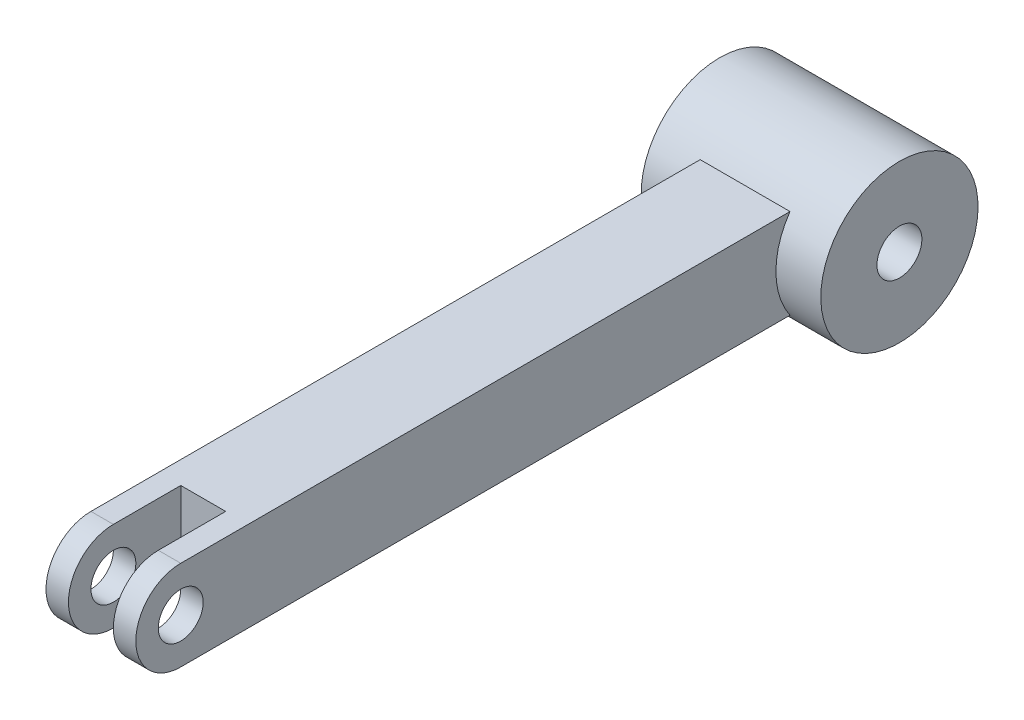
ISO-10303-21;
HEADER;
FILE_DESCRIPTION(('STEP AP214'),'2;1');
FILE_NAME('part.step','',(''),(''),'','','');
FILE_SCHEMA(('AUTOMOTIVE_DESIGN { 1 0 10303 214 1 1 1 1 }'));
ENDSEC;
DATA;
#1=APPLICATION_CONTEXT('core data for automotive mechanical design processes');
#2=APPLICATION_PROTOCOL_DEFINITION('international standard','automotive_design',2000,#1);
#3=PRODUCT_CONTEXT('',#1,'mechanical');
#4=PRODUCT('Part','Part','',(#3));
#5=PRODUCT_RELATED_PRODUCT_CATEGORY('part','',(#4));
#6=PRODUCT_DEFINITION_FORMATION('','',#4);
#7=PRODUCT_DEFINITION_CONTEXT('part definition',#1,'design');
#8=PRODUCT_DEFINITION('design','',#6,#7);
#9=PRODUCT_DEFINITION_SHAPE('','',#8);
#10=(LENGTH_UNIT() NAMED_UNIT(*) SI_UNIT(.MILLI.,.METRE.));
#11=(NAMED_UNIT(*) PLANE_ANGLE_UNIT() SI_UNIT($,.RADIAN.));
#12=(NAMED_UNIT(*) SI_UNIT($,.STERADIAN.) SOLID_ANGLE_UNIT());
#13=UNCERTAINTY_MEASURE_WITH_UNIT(LENGTH_MEASURE(1.E-05),#10,'distance_accuracy_value','');
#14=(GEOMETRIC_REPRESENTATION_CONTEXT(3) GLOBAL_UNCERTAINTY_ASSIGNED_CONTEXT((#13)) GLOBAL_UNIT_ASSIGNED_CONTEXT((#10,
#11,#12)) REPRESENTATION_CONTEXT('',''));
#15=CARTESIAN_POINT('',(0.,0.,0.));
#16=DIRECTION('',(0.,0.,1.));
#17=DIRECTION('',(1.,0.,0.));
#18=AXIS2_PLACEMENT_3D('',#15,#16,#17);
#19=CARTESIAN_POINT('',(-2.,0.,30.));
#20=DIRECTION('',(1.,0.,0.));
#21=DIRECTION('',(0.,1.,0.));
#22=AXIS2_PLACEMENT_3D('',#19,#20,#21);
#23=CYLINDRICAL_SURFACE('',#22,2.);
#24=CARTESIAN_POINT('',(1.,0.,30.));
#25=DIRECTION('',(1.,0.,0.));
#26=DIRECTION('',(0.,1.,0.));
#27=AXIS2_PLACEMENT_3D('',#24,#25,#26);
#28=CIRCLE('',#27,2.);
#29=CARTESIAN_POINT('',(1.,-2.,30.));
#30=VERTEX_POINT('',#29);
#31=CARTESIAN_POINT('',(1.,2.00000000000001,30.));
#32=VERTEX_POINT('',#31);
#33=EDGE_CURVE('E122',#30,#32,#28,.F.);
#34=ORIENTED_EDGE('',*,*,#33,.F.);
#35=DIRECTION('',(1.,0.,0.));
#36=VECTOR('',#35,1.);
#37=CARTESIAN_POINT('',(2.,-2.,30.));
#38=LINE('',#37,#36);
#39=CARTESIAN_POINT('',(2.,-2.,30.));
#40=VERTEX_POINT('',#39);
#41=EDGE_CURVE('E160',#30,#40,#38,.T.);
#42=ORIENTED_EDGE('',*,*,#41,.T.);
#43=CARTESIAN_POINT('',(2.,0.,30.));
#44=DIRECTION('',(1.,0.,0.));
#45=DIRECTION('',(0.,1.,0.));
#46=AXIS2_PLACEMENT_3D('',#43,#44,#45);
#47=CIRCLE('',#46,2.);
#48=CARTESIAN_POINT('',(2.,2.,30.));
#49=VERTEX_POINT('',#48);
#50=EDGE_CURVE('E154',#49,#40,#47,.T.);
#51=ORIENTED_EDGE('',*,*,#50,.F.);
#52=DIRECTION('',(-1.,0.,0.));
#53=VECTOR('',#52,1.);
#54=CARTESIAN_POINT('',(2.,2.,30.));
#55=LINE('',#54,#53);
#56=EDGE_CURVE('E166',#49,#32,#55,.T.);
#57=ORIENTED_EDGE('',*,*,#56,.T.);
#58=EDGE_LOOP('',(#34,#42,#51,#57));
#59=FACE_BOUND('',#58,.T.);
#60=ADVANCED_FACE('F33',(#59),#23,.T.);
#61=CARTESIAN_POINT('',(-2.,0.,30.));
#62=DIRECTION('',(1.,0.,0.));
#63=DIRECTION('',(0.,1.,0.));
#64=AXIS2_PLACEMENT_3D('',#61,#62,#63);
#65=CYLINDRICAL_SURFACE('',#64,0.999999999999998);
#66=CARTESIAN_POINT('',(1.,0.,30.));
#67=DIRECTION('',(1.,0.,0.));
#68=DIRECTION('',(0.,1.,0.));
#69=AXIS2_PLACEMENT_3D('',#66,#67,#68);
#70=CIRCLE('',#69,0.999999999999998);
#71=CARTESIAN_POINT('',(1.,1.,30.));
#72=VERTEX_POINT('',#71);
#73=EDGE_CURVE('E116',#72,#72,#70,.F.);
#74=ORIENTED_EDGE('',*,*,#73,.T.);
#75=EDGE_LOOP('',(#74));
#76=FACE_BOUND('',#75,.T.);
#77=CARTESIAN_POINT('',(2.,0.,30.));
#78=DIRECTION('',(1.,0.,0.));
#79=DIRECTION('',(0.,1.,0.));
#80=AXIS2_PLACEMENT_3D('',#77,#78,#79);
#81=CIRCLE('',#80,0.999999999999998);
#82=CARTESIAN_POINT('',(2.,1.,30.));
#83=VERTEX_POINT('',#82);
#84=EDGE_CURVE('E150',#83,#83,#81,.T.);
#85=ORIENTED_EDGE('',*,*,#84,.T.);
#86=EDGE_LOOP('',(#85));
#87=FACE_BOUND('',#86,.T.);
#88=ADVANCED_FACE('F186',(#76,#87),#65,.F.);
#89=CARTESIAN_POINT('',(-2.,2.,30.));
#90=DIRECTION('',(1.,0.,0.));
#91=DIRECTION('',(0.,0.,-1.));
#92=AXIS2_PLACEMENT_3D('',#89,#90,#91);
#93=PLANE('',#92);
#94=DIRECTION('',(0.,0.,-1.));
#95=VECTOR('',#94,1.);
#96=CARTESIAN_POINT('',(-2.,2.,30.));
#97=LINE('',#96,#95);
#98=CARTESIAN_POINT('',(-2.,2.,30.));
#99=VERTEX_POINT('',#98);
#100=CARTESIAN_POINT('',(-2.,2.,2.87228132326901));
#101=VERTEX_POINT('',#100);
#102=EDGE_CURVE('E169',#99,#101,#97,.T.);
#103=ORIENTED_EDGE('',*,*,#102,.T.);
#104=CARTESIAN_POINT('',(-2.,0.,0.));
#105=DIRECTION('',(1.,0.,0.));
#106=DIRECTION('',(0.,0.,-1.));
#107=AXIS2_PLACEMENT_3D('',#104,#105,#106);
#108=CIRCLE('',#107,3.5);
#109=CARTESIAN_POINT('',(-2.,-2.,2.87228132326901));
#110=VERTEX_POINT('',#109);
#111=EDGE_CURVE('E56',#101,#110,#108,.T.);
#112=ORIENTED_EDGE('',*,*,#111,.T.);
#113=DIRECTION('',(0.,0.,-1.));
#114=VECTOR('',#113,1.);
#115=CARTESIAN_POINT('',(-2.,-2.,30.));
#116=LINE('',#115,#114);
#117=CARTESIAN_POINT('',(-2.,-2.,30.));
#118=VERTEX_POINT('',#117);
#119=EDGE_CURVE('E178',#118,#110,#116,.T.);
#120=ORIENTED_EDGE('',*,*,#119,.F.);
#121=CARTESIAN_POINT('',(-2.,0.,30.));
#122=DIRECTION('',(1.,0.,0.));
#123=DIRECTION('',(0.,1.,0.));
#124=AXIS2_PLACEMENT_3D('',#121,#122,#123);
#125=CIRCLE('',#124,2.);
#126=EDGE_CURVE('E157',#99,#118,#125,.T.);
#127=ORIENTED_EDGE('',*,*,#126,.F.);
#128=EDGE_LOOP('',(#103,#112,#120,#127));
#129=FACE_BOUND('',#128,.T.);
#130=CARTESIAN_POINT('',(-2.,0.,30.));
#131=DIRECTION('',(1.,0.,0.));
#132=DIRECTION('',(0.,1.,0.));
#133=AXIS2_PLACEMENT_3D('',#130,#131,#132);
#134=CIRCLE('',#133,0.999999999999998);
#135=CARTESIAN_POINT('',(-2.,0.999999999999999,30.));
#136=VERTEX_POINT('',#135);
#137=EDGE_CURVE('E151',#136,#136,#134,.T.);
#138=ORIENTED_EDGE('',*,*,#137,.T.);
#139=EDGE_LOOP('',(#138));
#140=FACE_BOUND('',#139,.T.);
#141=ADVANCED_FACE('F35',(#129,#140),#93,.F.);
#142=CARTESIAN_POINT('',(2.,-2.,30.));
#143=DIRECTION('',(0.,1.,0.));
#144=DIRECTION('',(-1.,0.,0.));
#145=AXIS2_PLACEMENT_3D('',#142,#143,#144);
#146=PLANE('',#145);
#147=ORIENTED_EDGE('',*,*,#41,.F.);
#148=DIRECTION('',(0.,0.,-1.));
#149=VECTOR('',#148,1.);
#150=CARTESIAN_POINT('',(1.,-2.,30.));
#151=LINE('',#150,#149);
#152=CARTESIAN_POINT('',(1.,-2.,27.));
#153=VERTEX_POINT('',#152);
#154=EDGE_CURVE('E126',#30,#153,#151,.T.);
#155=ORIENTED_EDGE('',*,*,#154,.T.);
#156=DIRECTION('',(-1.,0.,0.));
#157=VECTOR('',#156,1.);
#158=CARTESIAN_POINT('',(2.,-2.,27.));
#159=LINE('',#158,#157);
#160=CARTESIAN_POINT('',(-0.999999999999999,-2.,27.));
#161=VERTEX_POINT('',#160);
#162=EDGE_CURVE('E129',#153,#161,#159,.T.);
#163=ORIENTED_EDGE('',*,*,#162,.T.);
#164=DIRECTION('',(0.,0.,1.));
#165=VECTOR('',#164,1.);
#166=CARTESIAN_POINT('',(-0.999999999999999,-2.,30.));
#167=LINE('',#166,#165);
#168=CARTESIAN_POINT('',(-0.999999999999999,-2.,30.));
#169=VERTEX_POINT('',#168);
#170=EDGE_CURVE('E108',#161,#169,#167,.T.);
#171=ORIENTED_EDGE('',*,*,#170,.T.);
#172=EDGE_CURVE('E163',#118,#169,#38,.T.);
#173=ORIENTED_EDGE('',*,*,#172,.F.);
#174=ORIENTED_EDGE('',*,*,#119,.T.);
#175=DIRECTION('',(1.,0.,0.));
#176=VECTOR('',#175,1.);
#177=CARTESIAN_POINT('',(-4.,-2.,2.87228132326901));
#178=LINE('',#177,#176);
#179=CARTESIAN_POINT('',(2.,-2.,2.87228132326901));
#180=VERTEX_POINT('',#179);
#181=EDGE_CURVE('E146',#110,#180,#178,.T.);
#182=ORIENTED_EDGE('',*,*,#181,.T.);
#183=DIRECTION('',(0.,0.,-1.));
#184=VECTOR('',#183,1.);
#185=CARTESIAN_POINT('',(2.,-2.,30.));
#186=LINE('',#185,#184);
#187=EDGE_CURVE('E175',#40,#180,#186,.T.);
#188=ORIENTED_EDGE('',*,*,#187,.F.);
#189=EDGE_LOOP('',(#147,#155,#163,#171,#173,#174,#182,#188));
#190=FACE_BOUND('',#189,.T.);
#191=ADVANCED_FACE('F209',(#190),#146,.F.);
#192=CARTESIAN_POINT('',(2.,2.,30.));
#193=DIRECTION('',(-1.,0.,0.));
#194=DIRECTION('',(0.,-1.,0.));
#195=AXIS2_PLACEMENT_3D('',#192,#193,#194);
#196=PLANE('',#195);
#197=ORIENTED_EDGE('',*,*,#187,.T.);
#198=CARTESIAN_POINT('',(2.,0.,0.));
#199=DIRECTION('',(-1.,0.,0.));
#200=DIRECTION('',(0.,-1.,0.));
#201=AXIS2_PLACEMENT_3D('',#198,#199,#200);
#202=CIRCLE('',#201,3.5);
#203=CARTESIAN_POINT('',(2.,2.,2.87228132326901));
#204=VERTEX_POINT('',#203);
#205=EDGE_CURVE('E143',#180,#204,#202,.T.);
#206=ORIENTED_EDGE('',*,*,#205,.T.);
#207=DIRECTION('',(0.,0.,-1.));
#208=VECTOR('',#207,1.);
#209=CARTESIAN_POINT('',(2.,2.,30.));
#210=LINE('',#209,#208);
#211=EDGE_CURVE('E172',#49,#204,#210,.T.);
#212=ORIENTED_EDGE('',*,*,#211,.F.);
#213=ORIENTED_EDGE('',*,*,#50,.T.);
#214=EDGE_LOOP('',(#197,#206,#212,#213));
#215=FACE_BOUND('',#214,.T.);
#216=ORIENTED_EDGE('',*,*,#84,.F.);
#217=EDGE_LOOP('',(#216));
#218=FACE_BOUND('',#217,.T.);
#219=ADVANCED_FACE('F200',(#215,#218),#196,.F.);
#220=CARTESIAN_POINT('',(2.,2.,30.));
#221=DIRECTION('',(0.,-1.,0.));
#222=DIRECTION('',(1.,0.,0.));
#223=AXIS2_PLACEMENT_3D('',#220,#221,#222);
#224=PLANE('',#223);
#225=DIRECTION('',(1.,0.,0.));
#226=VECTOR('',#225,1.);
#227=CARTESIAN_POINT('',(2.,2.,27.));
#228=LINE('',#227,#226);
#229=CARTESIAN_POINT('',(-1.,2.,27.));
#230=VERTEX_POINT('',#229);
#231=CARTESIAN_POINT('',(1.,2.,27.));
#232=VERTEX_POINT('',#231);
#233=EDGE_CURVE('E11',#230,#232,#228,.T.);
#234=ORIENTED_EDGE('',*,*,#233,.T.);
#235=DIRECTION('',(0.,0.,1.));
#236=VECTOR('',#235,1.);
#237=CARTESIAN_POINT('',(1.,2.,30.));
#238=LINE('',#237,#236);
#239=EDGE_CURVE('E124',#232,#32,#238,.T.);
#240=ORIENTED_EDGE('',*,*,#239,.T.);
#241=ORIENTED_EDGE('',*,*,#56,.F.);
#242=ORIENTED_EDGE('',*,*,#211,.T.);
#243=DIRECTION('',(1.,0.,0.));
#244=VECTOR('',#243,1.);
#245=CARTESIAN_POINT('',(-4.,2.,2.87228132326901));
#246=LINE('',#245,#244);
#247=EDGE_CURVE('E41',#204,#101,#246,.F.);
#248=ORIENTED_EDGE('',*,*,#247,.T.);
#249=ORIENTED_EDGE('',*,*,#102,.F.);
#250=CARTESIAN_POINT('',(-0.999999999999999,2.,30.));
#251=VERTEX_POINT('',#250);
#252=EDGE_CURVE('E113',#251,#99,#55,.T.);
#253=ORIENTED_EDGE('',*,*,#252,.F.);
#254=DIRECTION('',(0.,0.,-1.));
#255=VECTOR('',#254,1.);
#256=CARTESIAN_POINT('',(-1.,2.,30.));
#257=LINE('',#256,#255);
#258=EDGE_CURVE('E48',#251,#230,#257,.T.);
#259=ORIENTED_EDGE('',*,*,#258,.T.);
#260=EDGE_LOOP('',(#234,#240,#241,#242,#248,#249,#253,#259));
#261=FACE_BOUND('',#260,.T.);
#262=ADVANCED_FACE('F111',(#261),#224,.F.);
#263=CARTESIAN_POINT('',(-0.999999999999999,0.,30.));
#264=DIRECTION('',(-1.,0.,0.));
#265=DIRECTION('',(0.,-1.,0.));
#266=AXIS2_PLACEMENT_3D('',#263,#264,#265);
#267=CIRCLE('',#266,2.);
#268=EDGE_CURVE('E114',#251,#169,#267,.F.);
#269=ORIENTED_EDGE('',*,*,#268,.F.);
#270=ORIENTED_EDGE('',*,*,#252,.T.);
#271=ORIENTED_EDGE('',*,*,#126,.T.);
#272=ORIENTED_EDGE('',*,*,#172,.T.);
#273=EDGE_LOOP('',(#269,#270,#271,#272));
#274=FACE_BOUND('',#273,.T.);
#275=ADVANCED_FACE('F207',(#274),#23,.T.);
#276=CARTESIAN_POINT('',(-0.999999999999999,0.,30.));
#277=DIRECTION('',(-1.,0.,0.));
#278=DIRECTION('',(0.,-1.,0.));
#279=AXIS2_PLACEMENT_3D('',#276,#277,#278);
#280=CIRCLE('',#279,0.999999999999998);
#281=CARTESIAN_POINT('',(-0.999999999999999,-0.999999999999996,30.));
#282=VERTEX_POINT('',#281);
#283=EDGE_CURVE('E118',#282,#282,#280,.F.);
#284=ORIENTED_EDGE('',*,*,#283,.T.);
#285=EDGE_LOOP('',(#284));
#286=FACE_BOUND('',#285,.T.);
#287=ORIENTED_EDGE('',*,*,#137,.F.);
#288=EDGE_LOOP('',(#287));
#289=FACE_BOUND('',#288,.T.);
#290=ADVANCED_FACE('F213',(#286,#289),#65,.F.);
#291=CARTESIAN_POINT('',(-4.,0.,0.));
#292=DIRECTION('',(1.,0.,0.));
#293=DIRECTION('',(0.,1.,0.));
#294=AXIS2_PLACEMENT_3D('',#291,#292,#293);
#295=CYLINDRICAL_SURFACE('',#294,3.5);
#296=CARTESIAN_POINT('',(4.,0.,0.));
#297=DIRECTION('',(1.,0.,0.));
#298=DIRECTION('',(0.,1.,0.));
#299=AXIS2_PLACEMENT_3D('',#296,#297,#298);
#300=CIRCLE('',#299,3.5);
#301=CARTESIAN_POINT('',(4.,3.5,0.));
#302=VERTEX_POINT('',#301);
#303=EDGE_CURVE('E134',#302,#302,#300,.T.);
#304=ORIENTED_EDGE('',*,*,#303,.F.);
#305=EDGE_LOOP('',(#304));
#306=FACE_BOUND('',#305,.T.);
#307=CARTESIAN_POINT('',(-4.,0.,0.));
#308=DIRECTION('',(1.,0.,0.));
#309=DIRECTION('',(0.,1.,0.));
#310=AXIS2_PLACEMENT_3D('',#307,#308,#309);
#311=CIRCLE('',#310,3.5);
#312=CARTESIAN_POINT('',(-4.,3.5,0.));
#313=VERTEX_POINT('',#312);
#314=EDGE_CURVE('E140',#313,#313,#311,.T.);
#315=ORIENTED_EDGE('',*,*,#314,.T.);
#316=EDGE_LOOP('',(#315));
#317=FACE_BOUND('',#316,.T.);
#318=ORIENTED_EDGE('',*,*,#111,.F.);
#319=ORIENTED_EDGE('',*,*,#247,.F.);
#320=ORIENTED_EDGE('',*,*,#205,.F.);
#321=ORIENTED_EDGE('',*,*,#181,.F.);
#322=EDGE_LOOP('',(#318,#319,#320,#321));
#323=FACE_BOUND('',#322,.T.);
#324=ADVANCED_FACE('F210',(#306,#317,#323),#295,.T.);
#325=CARTESIAN_POINT('',(-4.,0.,0.));
#326=DIRECTION('',(1.,0.,0.));
#327=DIRECTION('',(0.,1.,0.));
#328=AXIS2_PLACEMENT_3D('',#325,#326,#327);
#329=PLANE('',#328);
#330=CARTESIAN_POINT('',(-4.,0.,0.));
#331=DIRECTION('',(1.,0.,0.));
#332=DIRECTION('',(0.,1.,0.));
#333=AXIS2_PLACEMENT_3D('',#330,#331,#332);
#334=CIRCLE('',#333,1.);
#335=CARTESIAN_POINT('',(-4.,0.999999999999999,0.));
#336=VERTEX_POINT('',#335);
#337=EDGE_CURVE('E137',#336,#336,#334,.T.);
#338=ORIENTED_EDGE('',*,*,#337,.T.);
#339=EDGE_LOOP('',(#338));
#340=FACE_BOUND('',#339,.T.);
#341=ORIENTED_EDGE('',*,*,#314,.F.);
#342=EDGE_LOOP('',(#341));
#343=FACE_BOUND('',#342,.T.);
#344=ADVANCED_FACE('F212',(#340,#343),#329,.F.);
#345=CARTESIAN_POINT('',(-4.,0.,0.));
#346=DIRECTION('',(1.,0.,0.));
#347=DIRECTION('',(0.,1.,0.));
#348=AXIS2_PLACEMENT_3D('',#345,#346,#347);
#349=CYLINDRICAL_SURFACE('',#348,1.);
#350=ORIENTED_EDGE('',*,*,#337,.F.);
#351=EDGE_LOOP('',(#350));
#352=FACE_BOUND('',#351,.T.);
#353=CARTESIAN_POINT('',(4.,0.,0.));
#354=DIRECTION('',(1.,0.,0.));
#355=DIRECTION('',(0.,1.,0.));
#356=AXIS2_PLACEMENT_3D('',#353,#354,#355);
#357=CIRCLE('',#356,1.);
#358=CARTESIAN_POINT('',(4.,1.,0.));
#359=VERTEX_POINT('',#358);
#360=EDGE_CURVE('E131',#359,#359,#357,.T.);
#361=ORIENTED_EDGE('',*,*,#360,.T.);
#362=EDGE_LOOP('',(#361));
#363=FACE_BOUND('',#362,.T.);
#364=ADVANCED_FACE('F220',(#352,#363),#349,.F.);
#365=CARTESIAN_POINT('',(4.,0.,0.));
#366=DIRECTION('',(1.,0.,0.));
#367=DIRECTION('',(0.,1.,0.));
#368=AXIS2_PLACEMENT_3D('',#365,#366,#367);
#369=PLANE('',#368);
#370=ORIENTED_EDGE('',*,*,#303,.T.);
#371=EDGE_LOOP('',(#370));
#372=FACE_BOUND('',#371,.T.);
#373=ORIENTED_EDGE('',*,*,#360,.F.);
#374=EDGE_LOOP('',(#373));
#375=FACE_BOUND('',#374,.T.);
#376=ADVANCED_FACE('F288',(#372,#375),#369,.T.);
#377=CARTESIAN_POINT('',(0.,0.,27.));
#378=DIRECTION('',(0.,0.,-1.));
#379=DIRECTION('',(-1.,0.,0.));
#380=AXIS2_PLACEMENT_3D('',#377,#378,#379);
#381=PLANE('',#380);
#382=DIRECTION('',(0.,1.,0.));
#383=VECTOR('',#382,1.);
#384=CARTESIAN_POINT('',(1.,2.5,27.));
#385=LINE('',#384,#383);
#386=EDGE_CURVE('E103',#153,#232,#385,.T.);
#387=ORIENTED_EDGE('',*,*,#386,.T.);
#388=ORIENTED_EDGE('',*,*,#233,.F.);
#389=DIRECTION('',(0.,-1.,0.));
#390=VECTOR('',#389,1.);
#391=CARTESIAN_POINT('',(-1.,2.5,27.));
#392=LINE('',#391,#390);
#393=EDGE_CURVE('E100',#230,#161,#392,.T.);
#394=ORIENTED_EDGE('',*,*,#393,.T.);
#395=ORIENTED_EDGE('',*,*,#162,.F.);
#396=EDGE_LOOP('',(#387,#388,#394,#395));
#397=FACE_BOUND('',#396,.T.);
#398=ADVANCED_FACE('F99',(#397),#381,.F.);
#399=CARTESIAN_POINT('',(1.,2.5,27.));
#400=DIRECTION('',(1.,0.,0.));
#401=DIRECTION('',(0.,1.,0.));
#402=AXIS2_PLACEMENT_3D('',#399,#400,#401);
#403=PLANE('',#402);
#404=ORIENTED_EDGE('',*,*,#73,.F.);
#405=EDGE_LOOP('',(#404));
#406=FACE_BOUND('',#405,.T.);
#407=ORIENTED_EDGE('',*,*,#33,.T.);
#408=ORIENTED_EDGE('',*,*,#239,.F.);
#409=ORIENTED_EDGE('',*,*,#386,.F.);
#410=ORIENTED_EDGE('',*,*,#154,.F.);
#411=EDGE_LOOP('',(#407,#408,#409,#410));
#412=FACE_BOUND('',#411,.T.);
#413=ADVANCED_FACE('F189',(#406,#412),#403,.F.);
#414=CARTESIAN_POINT('',(-1.,2.5,27.));
#415=DIRECTION('',(-1.,0.,0.));
#416=DIRECTION('',(0.,-1.,0.));
#417=AXIS2_PLACEMENT_3D('',#414,#415,#416);
#418=PLANE('',#417);
#419=ORIENTED_EDGE('',*,*,#283,.F.);
#420=EDGE_LOOP('',(#419));
#421=FACE_BOUND('',#420,.T.);
#422=ORIENTED_EDGE('',*,*,#393,.F.);
#423=ORIENTED_EDGE('',*,*,#258,.F.);
#424=ORIENTED_EDGE('',*,*,#268,.T.);
#425=ORIENTED_EDGE('',*,*,#170,.F.);
#426=EDGE_LOOP('',(#422,#423,#424,#425));
#427=FACE_BOUND('',#426,.T.);
#428=ADVANCED_FACE('F106',(#421,#427),#418,.F.);
#429=CLOSED_SHELL('',(#60,#88,#141,#191,#219,#262,#275,#290,#324,#344,#364,#376,#398,#413,#428));
#430=MANIFOLD_SOLID_BREP('B2',#429);
#431=ADVANCED_BREP_SHAPE_REPRESENTATION('',(#18,#430),#14);
#432=SHAPE_DEFINITION_REPRESENTATION(#9,#431);
ENDSEC;
END-ISO-10303-21;
